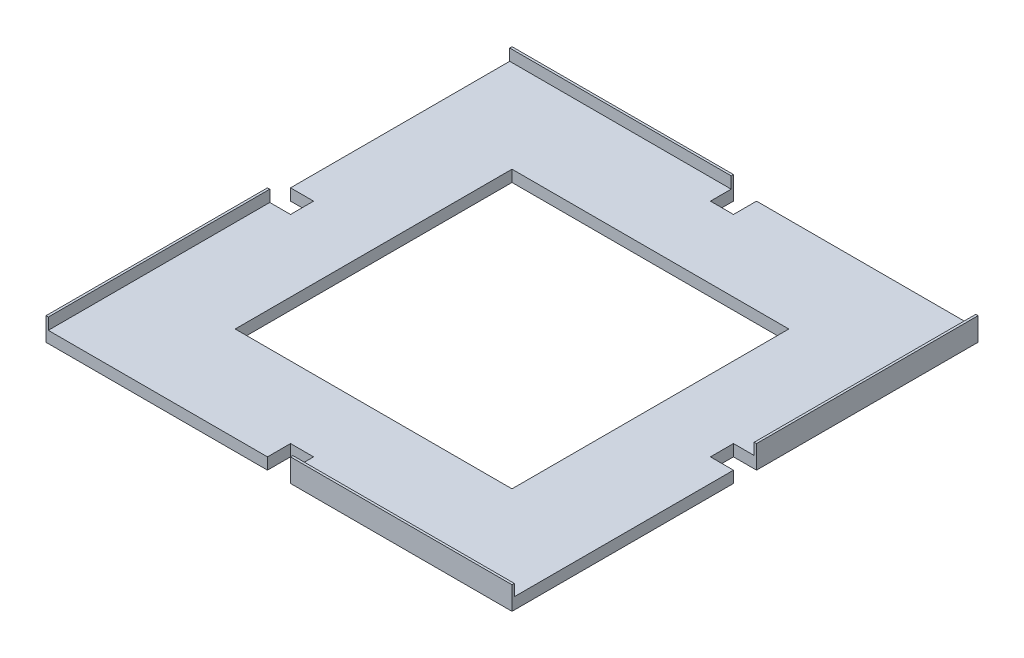
ISO-10303-21;
HEADER;
FILE_DESCRIPTION(('STEP AP214'),'2;1');
FILE_NAME('part.step','',(''),(''),'','','');
FILE_SCHEMA(('AUTOMOTIVE_DESIGN { 1 0 10303 214 1 1 1 1 }'));
ENDSEC;
DATA;
#1=APPLICATION_CONTEXT('core data for automotive mechanical design processes');
#2=APPLICATION_PROTOCOL_DEFINITION('international standard','automotive_design',2000,#1);
#3=PRODUCT_CONTEXT('',#1,'mechanical');
#4=PRODUCT('Part','Part','',(#3));
#5=PRODUCT_RELATED_PRODUCT_CATEGORY('part','',(#4));
#6=PRODUCT_DEFINITION_FORMATION('','',#4);
#7=PRODUCT_DEFINITION_CONTEXT('part definition',#1,'design');
#8=PRODUCT_DEFINITION('design','',#6,#7);
#9=PRODUCT_DEFINITION_SHAPE('','',#8);
#10=(LENGTH_UNIT() NAMED_UNIT(*) SI_UNIT(.MILLI.,.METRE.));
#11=(NAMED_UNIT(*) PLANE_ANGLE_UNIT() SI_UNIT($,.RADIAN.));
#12=(NAMED_UNIT(*) SI_UNIT($,.STERADIAN.) SOLID_ANGLE_UNIT());
#13=UNCERTAINTY_MEASURE_WITH_UNIT(LENGTH_MEASURE(1.E-05),#10,'distance_accuracy_value','');
#14=(GEOMETRIC_REPRESENTATION_CONTEXT(3) GLOBAL_UNCERTAINTY_ASSIGNED_CONTEXT((#13)) GLOBAL_UNIT_ASSIGNED_CONTEXT((#10,
#11,#12)) REPRESENTATION_CONTEXT('',''));
#15=CARTESIAN_POINT('',(0.,0.,0.));
#16=DIRECTION('',(0.,0.,1.));
#17=DIRECTION('',(1.,0.,0.));
#18=AXIS2_PLACEMENT_3D('',#15,#16,#17);
#19=CARTESIAN_POINT('',(0.,5.,0.));
#20=DIRECTION('',(0.,-1.,0.));
#21=DIRECTION('',(0.,0.,-1.));
#22=AXIS2_PLACEMENT_3D('',#19,#20,#21);
#23=PLANE('',#22);
#24=DIRECTION('',(0.,0.,-1.));
#25=VECTOR('',#24,1.);
#26=CARTESIAN_POINT('',(60.,5.,60.));
#27=LINE('',#26,#25);
#28=CARTESIAN_POINT('',(60.,5.,60.));
#29=VERTEX_POINT('',#28);
#30=CARTESIAN_POINT('',(60.,5.,-60.));
#31=VERTEX_POINT('',#30);
#32=EDGE_CURVE('E333',#29,#31,#27,.T.);
#33=ORIENTED_EDGE('',*,*,#32,.F.);
#34=DIRECTION('',(1.,0.,0.));
#35=VECTOR('',#34,1.);
#36=CARTESIAN_POINT('',(-60.,5.,60.));
#37=LINE('',#36,#35);
#38=CARTESIAN_POINT('',(-60.,5.,60.));
#39=VERTEX_POINT('',#38);
#40=EDGE_CURVE('E341',#39,#29,#37,.T.);
#41=ORIENTED_EDGE('',*,*,#40,.F.);
#42=DIRECTION('',(0.,0.,1.));
#43=VECTOR('',#42,1.);
#44=CARTESIAN_POINT('',(-60.,5.,60.));
#45=LINE('',#44,#43);
#46=CARTESIAN_POINT('',(-60.,5.,-60.));
#47=VERTEX_POINT('',#46);
#48=EDGE_CURVE('E338',#47,#39,#45,.T.);
#49=ORIENTED_EDGE('',*,*,#48,.F.);
#50=DIRECTION('',(-1.,0.,0.));
#51=VECTOR('',#50,1.);
#52=CARTESIAN_POINT('',(-60.,5.,-60.));
#53=LINE('',#52,#51);
#54=EDGE_CURVE('E335',#31,#47,#53,.T.);
#55=ORIENTED_EDGE('',*,*,#54,.F.);
#56=EDGE_LOOP('',(#33,#41,#49,#55));
#57=FACE_BOUND('',#56,.T.);
#58=DIRECTION('',(0.,0.,1.));
#59=VECTOR('',#58,1.);
#60=CARTESIAN_POINT('',(100.,5.,-4.99999999999894));
#61=LINE('',#60,#59);
#62=CARTESIAN_POINT('',(100.000000000001,5.,-100.999999999999));
#63=VERTEX_POINT('',#62);
#64=CARTESIAN_POINT('',(100.,5.,-5.));
#65=VERTEX_POINT('',#64);
#66=EDGE_CURVE('E257',#63,#65,#61,.T.);
#67=ORIENTED_EDGE('',*,*,#66,.F.);
#68=DIRECTION('',(-1.,0.,0.));
#69=VECTOR('',#68,1.);
#70=CARTESIAN_POINT('',(101.,5.,-101.));
#71=LINE('',#70,#69);
#72=CARTESIAN_POINT('',(5.00000000000002,5.,-101.));
#73=VERTEX_POINT('',#72);
#74=EDGE_CURVE('E246',#63,#73,#71,.T.);
#75=ORIENTED_EDGE('',*,*,#74,.T.);
#76=DIRECTION('',(0.,0.,1.));
#77=VECTOR('',#76,1.);
#78=CARTESIAN_POINT('',(5.00000000000002,5.,-101.));
#79=LINE('',#78,#77);
#80=CARTESIAN_POINT('',(5.00000000000001,5.,-91.));
#81=VERTEX_POINT('',#80);
#82=EDGE_CURVE('E255',#73,#81,#79,.T.);
#83=ORIENTED_EDGE('',*,*,#82,.T.);
#84=DIRECTION('',(-1.,0.,0.));
#85=VECTOR('',#84,1.);
#86=CARTESIAN_POINT('',(-5.,5.,-91.));
#87=LINE('',#86,#85);
#88=CARTESIAN_POINT('',(-5.,5.,-91.));
#89=VERTEX_POINT('',#88);
#90=EDGE_CURVE('E389',#81,#89,#87,.T.);
#91=ORIENTED_EDGE('',*,*,#90,.T.);
#92=DIRECTION('',(0.,0.,-1.));
#93=VECTOR('',#92,1.);
#94=CARTESIAN_POINT('',(-4.99999999999999,5.,-101.));
#95=LINE('',#94,#93);
#96=CARTESIAN_POINT('',(-4.99999999999999,5.,-100.));
#97=VERTEX_POINT('',#96);
#98=EDGE_CURVE('E391',#89,#97,#95,.T.);
#99=ORIENTED_EDGE('',*,*,#98,.T.);
#100=DIRECTION('',(1.,0.,0.));
#101=VECTOR('',#100,1.);
#102=CARTESIAN_POINT('',(-4.99999999999929,5.,-100.));
#103=LINE('',#102,#101);
#104=CARTESIAN_POINT('',(-101.,5.,-100.));
#105=VERTEX_POINT('',#104);
#106=EDGE_CURVE('E59',#105,#97,#103,.T.);
#107=ORIENTED_EDGE('',*,*,#106,.F.);
#108=DIRECTION('',(0.,0.,1.));
#109=VECTOR('',#108,1.);
#110=CARTESIAN_POINT('',(-101.,5.,-5.));
#111=LINE('',#110,#109);
#112=CARTESIAN_POINT('',(-101.,5.,-5.));
#113=VERTEX_POINT('',#112);
#114=EDGE_CURVE('E364',#105,#113,#111,.T.);
#115=ORIENTED_EDGE('',*,*,#114,.T.);
#116=DIRECTION('',(1.,0.,0.));
#117=VECTOR('',#116,1.);
#118=CARTESIAN_POINT('',(-101.,5.,-5.));
#119=LINE('',#118,#117);
#120=CARTESIAN_POINT('',(-90.9999999999999,5.,-5.00000000000001));
#121=VERTEX_POINT('',#120);
#122=EDGE_CURVE('E366',#113,#121,#119,.T.);
#123=ORIENTED_EDGE('',*,*,#122,.T.);
#124=DIRECTION('',(0.,0.,1.));
#125=VECTOR('',#124,1.);
#126=CARTESIAN_POINT('',(-91.,5.,5.00000000000001));
#127=LINE('',#126,#125);
#128=CARTESIAN_POINT('',(-91.,5.,5.00000000000001));
#129=VERTEX_POINT('',#128);
#130=EDGE_CURVE('E369',#121,#129,#127,.T.);
#131=ORIENTED_EDGE('',*,*,#130,.T.);
#132=DIRECTION('',(-1.,0.,0.));
#133=VECTOR('',#132,1.);
#134=CARTESIAN_POINT('',(-101.,5.,5.));
#135=LINE('',#134,#133);
#136=CARTESIAN_POINT('',(-100.,5.,5.));
#137=VERTEX_POINT('',#136);
#138=EDGE_CURVE('E371',#129,#137,#135,.T.);
#139=ORIENTED_EDGE('',*,*,#138,.T.);
#140=DIRECTION('',(0.,0.,-1.));
#141=VECTOR('',#140,1.);
#142=CARTESIAN_POINT('',(-100.,5.,4.99999999999964));
#143=LINE('',#142,#141);
#144=CARTESIAN_POINT('',(-100.,5.,101.));
#145=VERTEX_POINT('',#144);
#146=EDGE_CURVE('E301',#145,#137,#143,.T.);
#147=ORIENTED_EDGE('',*,*,#146,.F.);
#148=DIRECTION('',(1.,0.,0.));
#149=VECTOR('',#148,1.);
#150=CARTESIAN_POINT('',(-5.00000000000001,5.,101.));
#151=LINE('',#150,#149);
#152=CARTESIAN_POINT('',(-5.00000000000001,5.,101.));
#153=VERTEX_POINT('',#152);
#154=EDGE_CURVE('E373',#145,#153,#151,.T.);
#155=ORIENTED_EDGE('',*,*,#154,.T.);
#156=DIRECTION('',(0.,0.,-1.));
#157=VECTOR('',#156,1.);
#158=CARTESIAN_POINT('',(-5.00000000000001,5.,101.));
#159=LINE('',#158,#157);
#160=CARTESIAN_POINT('',(-4.99999999999998,5.,91.));
#161=VERTEX_POINT('',#160);
#162=EDGE_CURVE('E375',#153,#161,#159,.T.);
#163=ORIENTED_EDGE('',*,*,#162,.T.);
#164=DIRECTION('',(1.,0.,0.));
#165=VECTOR('',#164,1.);
#166=CARTESIAN_POINT('',(5.00000000000003,5.,91.));
#167=LINE('',#166,#165);
#168=CARTESIAN_POINT('',(5.00000000000003,5.,91.));
#169=VERTEX_POINT('',#168);
#170=EDGE_CURVE('E377',#161,#169,#167,.T.);
#171=ORIENTED_EDGE('',*,*,#170,.T.);
#172=DIRECTION('',(0.,0.,1.));
#173=VECTOR('',#172,1.);
#174=CARTESIAN_POINT('',(4.99999999999999,5.,101.));
#175=LINE('',#174,#173);
#176=CARTESIAN_POINT('',(4.99999999999999,5.,100.));
#177=VERTEX_POINT('',#176);
#178=EDGE_CURVE('E379',#169,#177,#175,.T.);
#179=ORIENTED_EDGE('',*,*,#178,.T.);
#180=DIRECTION('',(-1.,0.,0.));
#181=VECTOR('',#180,1.);
#182=CARTESIAN_POINT('',(4.99999999999999,5.,100.));
#183=LINE('',#182,#181);
#184=CARTESIAN_POINT('',(101.,5.,100.));
#185=VERTEX_POINT('',#184);
#186=EDGE_CURVE('E304',#185,#177,#183,.T.);
#187=ORIENTED_EDGE('',*,*,#186,.F.);
#188=DIRECTION('',(0.,0.,-1.));
#189=VECTOR('',#188,1.);
#190=CARTESIAN_POINT('',(101.,5.,101.));
#191=LINE('',#190,#189);
#192=CARTESIAN_POINT('',(101.,5.,5.));
#193=VERTEX_POINT('',#192);
#194=EDGE_CURVE('E381',#185,#193,#191,.T.);
#195=ORIENTED_EDGE('',*,*,#194,.T.);
#196=DIRECTION('',(-1.,0.,0.));
#197=VECTOR('',#196,1.);
#198=CARTESIAN_POINT('',(101.,5.,5.));
#199=LINE('',#198,#197);
#200=CARTESIAN_POINT('',(91.,5.,5.00000000000001));
#201=VERTEX_POINT('',#200);
#202=EDGE_CURVE('E383',#193,#201,#199,.T.);
#203=ORIENTED_EDGE('',*,*,#202,.T.);
#204=DIRECTION('',(0.,0.,-1.));
#205=VECTOR('',#204,1.);
#206=CARTESIAN_POINT('',(91.,5.,-4.99999999999999));
#207=LINE('',#206,#205);
#208=CARTESIAN_POINT('',(91.,5.,-4.99999999999999));
#209=VERTEX_POINT('',#208);
#210=EDGE_CURVE('E385',#201,#209,#207,.T.);
#211=ORIENTED_EDGE('',*,*,#210,.T.);
#212=DIRECTION('',(1.,0.,0.));
#213=VECTOR('',#212,1.);
#214=CARTESIAN_POINT('',(101.,5.,-5.));
#215=LINE('',#214,#213);
#216=EDGE_CURVE('E52',#209,#65,#215,.T.);
#217=ORIENTED_EDGE('',*,*,#216,.T.);
#218=EDGE_LOOP('',(#67,#75,#83,#91,#99,#107,#115,#123,#131,#139,#147,#155,#163,#171,#179,#187,
#195,#203,#211,#217));
#219=FACE_BOUND('',#218,.T.);
#220=ADVANCED_FACE('F37',(#57,#219),#23,.F.);
#221=CARTESIAN_POINT('',(0.,0.,0.));
#222=DIRECTION('',(0.,-1.,0.));
#223=DIRECTION('',(0.,0.,-1.));
#224=AXIS2_PLACEMENT_3D('',#221,#222,#223);
#225=PLANE('',#224);
#226=DIRECTION('',(-1.,0.,0.));
#227=VECTOR('',#226,1.);
#228=CARTESIAN_POINT('',(-4.99999999999999,0.,-101.));
#229=LINE('',#228,#227);
#230=CARTESIAN_POINT('',(-4.99999999999999,0.,-101.));
#231=VERTEX_POINT('',#230);
#232=CARTESIAN_POINT('',(-101.,0.,-101.));
#233=VERTEX_POINT('',#232);
#234=EDGE_CURVE('E363',#231,#233,#229,.T.);
#235=ORIENTED_EDGE('',*,*,#234,.F.);
#236=DIRECTION('',(0.,0.,-1.));
#237=VECTOR('',#236,1.);
#238=CARTESIAN_POINT('',(-4.99999999999999,0.,-101.));
#239=LINE('',#238,#237);
#240=CARTESIAN_POINT('',(-5.,0.,-91.));
#241=VERTEX_POINT('',#240);
#242=EDGE_CURVE('E367',#241,#231,#239,.T.);
#243=ORIENTED_EDGE('',*,*,#242,.F.);
#244=DIRECTION('',(-1.,0.,0.));
#245=VECTOR('',#244,1.);
#246=CARTESIAN_POINT('',(-5.,0.,-91.));
#247=LINE('',#246,#245);
#248=CARTESIAN_POINT('',(5.00000000000001,0.,-91.));
#249=VERTEX_POINT('',#248);
#250=EDGE_CURVE('E430',#249,#241,#247,.T.);
#251=ORIENTED_EDGE('',*,*,#250,.F.);
#252=DIRECTION('',(0.,0.,1.));
#253=VECTOR('',#252,1.);
#254=CARTESIAN_POINT('',(5.00000000000002,0.,-101.));
#255=LINE('',#254,#253);
#256=CARTESIAN_POINT('',(5.00000000000002,0.,-101.));
#257=VERTEX_POINT('',#256);
#258=EDGE_CURVE('E428',#257,#249,#255,.T.);
#259=ORIENTED_EDGE('',*,*,#258,.F.);
#260=DIRECTION('',(-1.,0.,0.));
#261=VECTOR('',#260,1.);
#262=CARTESIAN_POINT('',(101.,0.,-101.));
#263=LINE('',#262,#261);
#264=CARTESIAN_POINT('',(101.,0.,-101.));
#265=VERTEX_POINT('',#264);
#266=EDGE_CURVE('E426',#265,#257,#263,.T.);
#267=ORIENTED_EDGE('',*,*,#266,.F.);
#268=DIRECTION('',(0.,0.,-1.));
#269=VECTOR('',#268,1.);
#270=CARTESIAN_POINT('',(101.,0.,-5.));
#271=LINE('',#270,#269);
#272=CARTESIAN_POINT('',(101.,0.,-5.));
#273=VERTEX_POINT('',#272);
#274=EDGE_CURVE('E424',#273,#265,#271,.T.);
#275=ORIENTED_EDGE('',*,*,#274,.F.);
#276=DIRECTION('',(1.,0.,0.));
#277=VECTOR('',#276,1.);
#278=CARTESIAN_POINT('',(101.,0.,-5.));
#279=LINE('',#278,#277);
#280=CARTESIAN_POINT('',(91.,0.,-4.99999999999999));
#281=VERTEX_POINT('',#280);
#282=EDGE_CURVE('E422',#281,#273,#279,.T.);
#283=ORIENTED_EDGE('',*,*,#282,.F.);
#284=DIRECTION('',(0.,0.,-1.));
#285=VECTOR('',#284,1.);
#286=CARTESIAN_POINT('',(91.,0.,-4.99999999999999));
#287=LINE('',#286,#285);
#288=CARTESIAN_POINT('',(91.,0.,5.00000000000001));
#289=VERTEX_POINT('',#288);
#290=EDGE_CURVE('E420',#289,#281,#287,.T.);
#291=ORIENTED_EDGE('',*,*,#290,.F.);
#292=DIRECTION('',(-1.,0.,0.));
#293=VECTOR('',#292,1.);
#294=CARTESIAN_POINT('',(101.,0.,5.));
#295=LINE('',#294,#293);
#296=CARTESIAN_POINT('',(101.,0.,5.));
#297=VERTEX_POINT('',#296);
#298=EDGE_CURVE('E418',#297,#289,#295,.T.);
#299=ORIENTED_EDGE('',*,*,#298,.F.);
#300=DIRECTION('',(0.,0.,-1.));
#301=VECTOR('',#300,1.);
#302=CARTESIAN_POINT('',(101.,0.,101.));
#303=LINE('',#302,#301);
#304=CARTESIAN_POINT('',(101.,0.,101.));
#305=VERTEX_POINT('',#304);
#306=EDGE_CURVE('E416',#305,#297,#303,.T.);
#307=ORIENTED_EDGE('',*,*,#306,.F.);
#308=DIRECTION('',(1.,0.,0.));
#309=VECTOR('',#308,1.);
#310=CARTESIAN_POINT('',(101.,0.,101.));
#311=LINE('',#310,#309);
#312=CARTESIAN_POINT('',(4.99999999999999,0.,101.));
#313=VERTEX_POINT('',#312);
#314=EDGE_CURVE('E414',#313,#305,#311,.T.);
#315=ORIENTED_EDGE('',*,*,#314,.F.);
#316=DIRECTION('',(0.,0.,1.));
#317=VECTOR('',#316,1.);
#318=CARTESIAN_POINT('',(4.99999999999999,0.,101.));
#319=LINE('',#318,#317);
#320=CARTESIAN_POINT('',(5.00000000000003,0.,91.));
#321=VERTEX_POINT('',#320);
#322=EDGE_CURVE('E412',#321,#313,#319,.T.);
#323=ORIENTED_EDGE('',*,*,#322,.F.);
#324=DIRECTION('',(1.,0.,0.));
#325=VECTOR('',#324,1.);
#326=CARTESIAN_POINT('',(5.00000000000003,0.,91.));
#327=LINE('',#326,#325);
#328=CARTESIAN_POINT('',(-4.99999999999998,0.,91.));
#329=VERTEX_POINT('',#328);
#330=EDGE_CURVE('E410',#329,#321,#327,.T.);
#331=ORIENTED_EDGE('',*,*,#330,.F.);
#332=DIRECTION('',(0.,0.,-1.));
#333=VECTOR('',#332,1.);
#334=CARTESIAN_POINT('',(-5.00000000000001,0.,101.));
#335=LINE('',#334,#333);
#336=CARTESIAN_POINT('',(-5.00000000000001,0.,101.));
#337=VERTEX_POINT('',#336);
#338=EDGE_CURVE('E408',#337,#329,#335,.T.);
#339=ORIENTED_EDGE('',*,*,#338,.F.);
#340=DIRECTION('',(1.,0.,0.));
#341=VECTOR('',#340,1.);
#342=CARTESIAN_POINT('',(-5.00000000000001,0.,101.));
#343=LINE('',#342,#341);
#344=CARTESIAN_POINT('',(-101.,0.,101.));
#345=VERTEX_POINT('',#344);
#346=EDGE_CURVE('E406',#345,#337,#343,.T.);
#347=ORIENTED_EDGE('',*,*,#346,.F.);
#348=DIRECTION('',(0.,0.,1.));
#349=VECTOR('',#348,1.);
#350=CARTESIAN_POINT('',(-101.,0.,101.));
#351=LINE('',#350,#349);
#352=CARTESIAN_POINT('',(-101.,0.,5.));
#353=VERTEX_POINT('',#352);
#354=EDGE_CURVE('E404',#353,#345,#351,.T.);
#355=ORIENTED_EDGE('',*,*,#354,.F.);
#356=DIRECTION('',(-1.,0.,0.));
#357=VECTOR('',#356,1.);
#358=CARTESIAN_POINT('',(-101.,0.,5.));
#359=LINE('',#358,#357);
#360=CARTESIAN_POINT('',(-91.,0.,5.00000000000001));
#361=VERTEX_POINT('',#360);
#362=EDGE_CURVE('E402',#361,#353,#359,.T.);
#363=ORIENTED_EDGE('',*,*,#362,.F.);
#364=DIRECTION('',(0.,0.,1.));
#365=VECTOR('',#364,1.);
#366=CARTESIAN_POINT('',(-91.,0.,5.00000000000001));
#367=LINE('',#366,#365);
#368=CARTESIAN_POINT('',(-90.9999999999999,0.,-5.00000000000001));
#369=VERTEX_POINT('',#368);
#370=EDGE_CURVE('E400',#369,#361,#367,.T.);
#371=ORIENTED_EDGE('',*,*,#370,.F.);
#372=DIRECTION('',(1.,0.,0.));
#373=VECTOR('',#372,1.);
#374=CARTESIAN_POINT('',(-101.,0.,-5.));
#375=LINE('',#374,#373);
#376=CARTESIAN_POINT('',(-101.,0.,-5.));
#377=VERTEX_POINT('',#376);
#378=EDGE_CURVE('E398',#377,#369,#375,.T.);
#379=ORIENTED_EDGE('',*,*,#378,.F.);
#380=DIRECTION('',(0.,0.,1.));
#381=VECTOR('',#380,1.);
#382=CARTESIAN_POINT('',(-101.,0.,-5.));
#383=LINE('',#382,#381);
#384=EDGE_CURVE('E396',#233,#377,#383,.T.);
#385=ORIENTED_EDGE('',*,*,#384,.F.);
#386=EDGE_LOOP('',(#235,#243,#251,#259,#267,#275,#283,#291,#299,#307,#315,#323,#331,#339,#347,
#355,#363,#371,#379,#385));
#387=FACE_BOUND('',#386,.T.);
#388=DIRECTION('',(1.,0.,0.));
#389=VECTOR('',#388,1.);
#390=CARTESIAN_POINT('',(-60.,0.,60.));
#391=LINE('',#390,#389);
#392=CARTESIAN_POINT('',(-60.,0.,60.));
#393=VERTEX_POINT('',#392);
#394=CARTESIAN_POINT('',(60.,0.,60.));
#395=VERTEX_POINT('',#394);
#396=EDGE_CURVE('E336',#393,#395,#391,.T.);
#397=ORIENTED_EDGE('',*,*,#396,.T.);
#398=DIRECTION('',(0.,0.,-1.));
#399=VECTOR('',#398,1.);
#400=CARTESIAN_POINT('',(60.,0.,60.));
#401=LINE('',#400,#399);
#402=CARTESIAN_POINT('',(60.,0.,-60.));
#403=VERTEX_POINT('',#402);
#404=EDGE_CURVE('E332',#395,#403,#401,.T.);
#405=ORIENTED_EDGE('',*,*,#404,.T.);
#406=DIRECTION('',(-1.,0.,0.));
#407=VECTOR('',#406,1.);
#408=CARTESIAN_POINT('',(-60.,0.,-60.));
#409=LINE('',#408,#407);
#410=CARTESIAN_POINT('',(-60.,0.,-60.));
#411=VERTEX_POINT('',#410);
#412=EDGE_CURVE('E346',#403,#411,#409,.T.);
#413=ORIENTED_EDGE('',*,*,#412,.T.);
#414=DIRECTION('',(0.,0.,1.));
#415=VECTOR('',#414,1.);
#416=CARTESIAN_POINT('',(-60.,0.,60.));
#417=LINE('',#416,#415);
#418=EDGE_CURVE('E349',#411,#393,#417,.T.);
#419=ORIENTED_EDGE('',*,*,#418,.T.);
#420=EDGE_LOOP('',(#397,#405,#413,#419));
#421=FACE_BOUND('',#420,.T.);
#422=ADVANCED_FACE('F494',(#387,#421),#225,.T.);
#423=CARTESIAN_POINT('',(-4.99999999999999,5.,-101.));
#424=DIRECTION('',(0.,0.,1.));
#425=DIRECTION('',(1.,0.,0.));
#426=AXIS2_PLACEMENT_3D('',#423,#424,#425);
#427=PLANE('',#426);
#428=ORIENTED_EDGE('',*,*,#234,.T.);
#429=DIRECTION('',(0.,-1.,0.));
#430=VECTOR('',#429,1.);
#431=CARTESIAN_POINT('',(-101.,5.,-101.));
#432=LINE('',#431,#430);
#433=CARTESIAN_POINT('',(-100.999999999999,10.,-101.000000000001));
#434=VERTEX_POINT('',#433);
#435=EDGE_CURVE('E11',#434,#233,#432,.T.);
#436=ORIENTED_EDGE('',*,*,#435,.F.);
#437=DIRECTION('',(-1.,0.,0.));
#438=VECTOR('',#437,1.);
#439=CARTESIAN_POINT('',(-4.99999999999929,10.,-101.));
#440=LINE('',#439,#438);
#441=CARTESIAN_POINT('',(-4.99999999999929,10.,-101.));
#442=VERTEX_POINT('',#441);
#443=EDGE_CURVE('E286',#442,#434,#440,.T.);
#444=ORIENTED_EDGE('',*,*,#443,.F.);
#445=DIRECTION('',(0.,-1.,0.));
#446=VECTOR('',#445,1.);
#447=CARTESIAN_POINT('',(-4.99999999999999,5.,-101.));
#448=LINE('',#447,#446);
#449=EDGE_CURVE('E393',#442,#231,#448,.T.);
#450=ORIENTED_EDGE('',*,*,#449,.T.);
#451=EDGE_LOOP('',(#428,#436,#444,#450));
#452=FACE_BOUND('',#451,.T.);
#453=ADVANCED_FACE('F39',(#452),#427,.F.);
#454=CARTESIAN_POINT('',(-101.,5.,-5.));
#455=DIRECTION('',(1.,0.,0.));
#456=DIRECTION('',(0.,0.,-1.));
#457=AXIS2_PLACEMENT_3D('',#454,#455,#456);
#458=PLANE('',#457);
#459=ORIENTED_EDGE('',*,*,#384,.T.);
#460=DIRECTION('',(0.,-1.,0.));
#461=VECTOR('',#460,1.);
#462=CARTESIAN_POINT('',(-101.,5.,-5.));
#463=LINE('',#462,#461);
#464=EDGE_CURVE('E45',#113,#377,#463,.T.);
#465=ORIENTED_EDGE('',*,*,#464,.F.);
#466=ORIENTED_EDGE('',*,*,#114,.F.);
#467=DIRECTION('',(0.,-1.,0.));
#468=VECTOR('',#467,1.);
#469=CARTESIAN_POINT('',(-100.999999999999,10.,-100.000000000001));
#470=LINE('',#469,#468);
#471=CARTESIAN_POINT('',(-100.999999999999,10.,-100.000000000001));
#472=VERTEX_POINT('',#471);
#473=EDGE_CURVE('E261',#472,#105,#470,.T.);
#474=ORIENTED_EDGE('',*,*,#473,.F.);
#475=DIRECTION('',(0.,0.,1.));
#476=VECTOR('',#475,1.);
#477=CARTESIAN_POINT('',(-100.999999999999,10.,-101.000000000001));
#478=LINE('',#477,#476);
#479=EDGE_CURVE('E291',#434,#472,#478,.T.);
#480=ORIENTED_EDGE('',*,*,#479,.F.);
#481=ORIENTED_EDGE('',*,*,#435,.T.);
#482=EDGE_LOOP('',(#459,#465,#466,#474,#480,#481));
#483=FACE_BOUND('',#482,.T.);
#484=ADVANCED_FACE('F586',(#483),#458,.F.);
#485=CARTESIAN_POINT('',(-101.,5.,-5.));
#486=DIRECTION('',(0.,0.,-1.));
#487=DIRECTION('',(-1.,0.,0.));
#488=AXIS2_PLACEMENT_3D('',#485,#486,#487);
#489=PLANE('',#488);
#490=ORIENTED_EDGE('',*,*,#378,.T.);
#491=DIRECTION('',(0.,-1.,0.));
#492=VECTOR('',#491,1.);
#493=CARTESIAN_POINT('',(-90.9999999999999,5.,-5.00000000000001));
#494=LINE('',#493,#492);
#495=EDGE_CURVE('E481',#121,#369,#494,.T.);
#496=ORIENTED_EDGE('',*,*,#495,.F.);
#497=ORIENTED_EDGE('',*,*,#122,.F.);
#498=ORIENTED_EDGE('',*,*,#464,.T.);
#499=EDGE_LOOP('',(#490,#496,#497,#498));
#500=FACE_BOUND('',#499,.T.);
#501=ADVANCED_FACE('F488',(#500),#489,.F.);
#502=CARTESIAN_POINT('',(-91.,5.,5.00000000000001));
#503=DIRECTION('',(1.,0.,0.));
#504=DIRECTION('',(0.,0.,-1.));
#505=AXIS2_PLACEMENT_3D('',#502,#503,#504);
#506=PLANE('',#505);
#507=ORIENTED_EDGE('',*,*,#370,.T.);
#508=DIRECTION('',(0.,-1.,0.));
#509=VECTOR('',#508,1.);
#510=CARTESIAN_POINT('',(-91.,5.,5.00000000000001));
#511=LINE('',#510,#509);
#512=EDGE_CURVE('E478',#129,#361,#511,.T.);
#513=ORIENTED_EDGE('',*,*,#512,.F.);
#514=ORIENTED_EDGE('',*,*,#130,.F.);
#515=ORIENTED_EDGE('',*,*,#495,.T.);
#516=EDGE_LOOP('',(#507,#513,#514,#515));
#517=FACE_BOUND('',#516,.T.);
#518=ADVANCED_FACE('F500',(#517),#506,.F.);
#519=CARTESIAN_POINT('',(-101.,5.,5.));
#520=DIRECTION('',(0.,0.,1.));
#521=DIRECTION('',(1.,0.,0.));
#522=AXIS2_PLACEMENT_3D('',#519,#520,#521);
#523=PLANE('',#522);
#524=ORIENTED_EDGE('',*,*,#362,.T.);
#525=DIRECTION('',(0.,-1.,0.));
#526=VECTOR('',#525,1.);
#527=CARTESIAN_POINT('',(-101.,5.,5.));
#528=LINE('',#527,#526);
#529=CARTESIAN_POINT('',(-101.,10.,4.99999999999964));
#530=VERTEX_POINT('',#529);
#531=EDGE_CURVE('E475',#530,#353,#528,.T.);
#532=ORIENTED_EDGE('',*,*,#531,.F.);
#533=DIRECTION('',(-1.,0.,0.));
#534=VECTOR('',#533,1.);
#535=CARTESIAN_POINT('',(-101.,10.,4.99999999999964));
#536=LINE('',#535,#534);
#537=CARTESIAN_POINT('',(-100.,10.,4.99999999999964));
#538=VERTEX_POINT('',#537);
#539=EDGE_CURVE('E300',#538,#530,#536,.T.);
#540=ORIENTED_EDGE('',*,*,#539,.F.);
#541=DIRECTION('',(0.,-1.,0.));
#542=VECTOR('',#541,1.);
#543=CARTESIAN_POINT('',(-100.,10.,4.99999999999964));
#544=LINE('',#543,#542);
#545=EDGE_CURVE('E297',#538,#137,#544,.T.);
#546=ORIENTED_EDGE('',*,*,#545,.T.);
#547=ORIENTED_EDGE('',*,*,#138,.F.);
#548=ORIENTED_EDGE('',*,*,#512,.T.);
#549=EDGE_LOOP('',(#524,#532,#540,#546,#547,#548));
#550=FACE_BOUND('',#549,.T.);
#551=ADVANCED_FACE('F504',(#550),#523,.F.);
#552=CARTESIAN_POINT('',(-101.,5.,101.));
#553=DIRECTION('',(1.,0.,0.));
#554=DIRECTION('',(0.,0.,-1.));
#555=AXIS2_PLACEMENT_3D('',#552,#553,#554);
#556=PLANE('',#555);
#557=ORIENTED_EDGE('',*,*,#354,.T.);
#558=DIRECTION('',(0.,-1.,0.));
#559=VECTOR('',#558,1.);
#560=CARTESIAN_POINT('',(-101.,5.,101.));
#561=LINE('',#560,#559);
#562=CARTESIAN_POINT('',(-101.,10.,101.));
#563=VERTEX_POINT('',#562);
#564=EDGE_CURVE('E472',#563,#345,#561,.T.);
#565=ORIENTED_EDGE('',*,*,#564,.F.);
#566=DIRECTION('',(0.,0.,1.));
#567=VECTOR('',#566,1.);
#568=CARTESIAN_POINT('',(-101.,10.,4.99999999999964));
#569=LINE('',#568,#567);
#570=EDGE_CURVE('E305',#530,#563,#569,.T.);
#571=ORIENTED_EDGE('',*,*,#570,.F.);
#572=ORIENTED_EDGE('',*,*,#531,.T.);
#573=EDGE_LOOP('',(#557,#565,#571,#572));
#574=FACE_BOUND('',#573,.T.);
#575=ADVANCED_FACE('F635',(#574),#556,.F.);
#576=CARTESIAN_POINT('',(-5.00000000000001,5.,101.));
#577=DIRECTION('',(0.,0.,-1.));
#578=DIRECTION('',(-1.,0.,0.));
#579=AXIS2_PLACEMENT_3D('',#576,#577,#578);
#580=PLANE('',#579);
#581=ORIENTED_EDGE('',*,*,#346,.T.);
#582=DIRECTION('',(0.,-1.,0.));
#583=VECTOR('',#582,1.);
#584=CARTESIAN_POINT('',(-5.00000000000001,5.,101.));
#585=LINE('',#584,#583);
#586=EDGE_CURVE('E469',#153,#337,#585,.T.);
#587=ORIENTED_EDGE('',*,*,#586,.F.);
#588=ORIENTED_EDGE('',*,*,#154,.F.);
#589=DIRECTION('',(0.,-1.,0.));
#590=VECTOR('',#589,1.);
#591=CARTESIAN_POINT('',(-100.,10.,101.));
#592=LINE('',#591,#590);
#593=CARTESIAN_POINT('',(-100.,10.,101.));
#594=VERTEX_POINT('',#593);
#595=EDGE_CURVE('E285',#594,#145,#592,.T.);
#596=ORIENTED_EDGE('',*,*,#595,.F.);
#597=DIRECTION('',(1.,0.,0.));
#598=VECTOR('',#597,1.);
#599=CARTESIAN_POINT('',(-101.,10.,101.));
#600=LINE('',#599,#598);
#601=EDGE_CURVE('E310',#563,#594,#600,.T.);
#602=ORIENTED_EDGE('',*,*,#601,.F.);
#603=ORIENTED_EDGE('',*,*,#564,.T.);
#604=EDGE_LOOP('',(#581,#587,#588,#596,#602,#603));
#605=FACE_BOUND('',#604,.T.);
#606=ADVANCED_FACE('F514',(#605),#580,.F.);
#607=CARTESIAN_POINT('',(-5.00000000000001,5.,101.));
#608=DIRECTION('',(-1.,0.,0.));
#609=DIRECTION('',(0.,0.,1.));
#610=AXIS2_PLACEMENT_3D('',#607,#608,#609);
#611=PLANE('',#610);
#612=ORIENTED_EDGE('',*,*,#338,.T.);
#613=DIRECTION('',(0.,-1.,0.));
#614=VECTOR('',#613,1.);
#615=CARTESIAN_POINT('',(-4.99999999999998,5.,91.));
#616=LINE('',#615,#614);
#617=EDGE_CURVE('E466',#161,#329,#616,.T.);
#618=ORIENTED_EDGE('',*,*,#617,.F.);
#619=ORIENTED_EDGE('',*,*,#162,.F.);
#620=ORIENTED_EDGE('',*,*,#586,.T.);
#621=EDGE_LOOP('',(#612,#618,#619,#620));
#622=FACE_BOUND('',#621,.T.);
#623=ADVANCED_FACE('F521',(#622),#611,.F.);
#624=CARTESIAN_POINT('',(5.00000000000003,5.,91.));
#625=DIRECTION('',(0.,0.,-1.));
#626=DIRECTION('',(-1.,0.,0.));
#627=AXIS2_PLACEMENT_3D('',#624,#625,#626);
#628=PLANE('',#627);
#629=ORIENTED_EDGE('',*,*,#330,.T.);
#630=DIRECTION('',(0.,-1.,0.));
#631=VECTOR('',#630,1.);
#632=CARTESIAN_POINT('',(5.00000000000003,5.,91.));
#633=LINE('',#632,#631);
#634=EDGE_CURVE('E463',#169,#321,#633,.T.);
#635=ORIENTED_EDGE('',*,*,#634,.F.);
#636=ORIENTED_EDGE('',*,*,#170,.F.);
#637=ORIENTED_EDGE('',*,*,#617,.T.);
#638=EDGE_LOOP('',(#629,#635,#636,#637));
#639=FACE_BOUND('',#638,.T.);
#640=ADVANCED_FACE('F525',(#639),#628,.F.);
#641=CARTESIAN_POINT('',(4.99999999999999,5.,101.));
#642=DIRECTION('',(1.,0.,0.));
#643=DIRECTION('',(0.,0.,-1.));
#644=AXIS2_PLACEMENT_3D('',#641,#642,#643);
#645=PLANE('',#644);
#646=ORIENTED_EDGE('',*,*,#322,.T.);
#647=DIRECTION('',(0.,-1.,0.));
#648=VECTOR('',#647,1.);
#649=CARTESIAN_POINT('',(4.99999999999999,5.,101.));
#650=LINE('',#649,#648);
#651=CARTESIAN_POINT('',(4.99999999999999,10.,101.));
#652=VERTEX_POINT('',#651);
#653=EDGE_CURVE('E460',#652,#313,#650,.T.);
#654=ORIENTED_EDGE('',*,*,#653,.F.);
#655=DIRECTION('',(0.,0.,1.));
#656=VECTOR('',#655,1.);
#657=CARTESIAN_POINT('',(4.99999999999999,10.,101.));
#658=LINE('',#657,#656);
#659=CARTESIAN_POINT('',(4.99999999999999,10.,100.));
#660=VERTEX_POINT('',#659);
#661=EDGE_CURVE('E314',#660,#652,#658,.T.);
#662=ORIENTED_EDGE('',*,*,#661,.F.);
#663=DIRECTION('',(0.,-1.,0.));
#664=VECTOR('',#663,1.);
#665=CARTESIAN_POINT('',(4.99999999999999,10.,100.));
#666=LINE('',#665,#664);
#667=EDGE_CURVE('E324',#660,#177,#666,.T.);
#668=ORIENTED_EDGE('',*,*,#667,.T.);
#669=ORIENTED_EDGE('',*,*,#178,.F.);
#670=ORIENTED_EDGE('',*,*,#634,.T.);
#671=EDGE_LOOP('',(#646,#654,#662,#668,#669,#670));
#672=FACE_BOUND('',#671,.T.);
#673=ADVANCED_FACE('F529',(#672),#645,.F.);
#674=CARTESIAN_POINT('',(101.,5.,101.));
#675=DIRECTION('',(0.,0.,-1.));
#676=DIRECTION('',(-1.,0.,0.));
#677=AXIS2_PLACEMENT_3D('',#674,#675,#676);
#678=PLANE('',#677);
#679=ORIENTED_EDGE('',*,*,#314,.T.);
#680=DIRECTION('',(0.,-1.,0.));
#681=VECTOR('',#680,1.);
#682=CARTESIAN_POINT('',(101.,5.,101.));
#683=LINE('',#682,#681);
#684=CARTESIAN_POINT('',(101.,10.,101.));
#685=VERTEX_POINT('',#684);
#686=EDGE_CURVE('E457',#685,#305,#683,.T.);
#687=ORIENTED_EDGE('',*,*,#686,.F.);
#688=DIRECTION('',(1.,0.,0.));
#689=VECTOR('',#688,1.);
#690=CARTESIAN_POINT('',(4.99999999999999,10.,101.));
#691=LINE('',#690,#689);
#692=EDGE_CURVE('E317',#652,#685,#691,.T.);
#693=ORIENTED_EDGE('',*,*,#692,.F.);
#694=ORIENTED_EDGE('',*,*,#653,.T.);
#695=EDGE_LOOP('',(#679,#687,#693,#694));
#696=FACE_BOUND('',#695,.T.);
#697=ADVANCED_FACE('F623',(#696),#678,.F.);
#698=CARTESIAN_POINT('',(101.,5.,101.));
#699=DIRECTION('',(-1.,0.,0.));
#700=DIRECTION('',(0.,0.,1.));
#701=AXIS2_PLACEMENT_3D('',#698,#699,#700);
#702=PLANE('',#701);
#703=ORIENTED_EDGE('',*,*,#306,.T.);
#704=DIRECTION('',(0.,-1.,0.));
#705=VECTOR('',#704,1.);
#706=CARTESIAN_POINT('',(101.,5.,5.));
#707=LINE('',#706,#705);
#708=EDGE_CURVE('E454',#193,#297,#707,.T.);
#709=ORIENTED_EDGE('',*,*,#708,.F.);
#710=ORIENTED_EDGE('',*,*,#194,.F.);
#711=DIRECTION('',(0.,-1.,0.));
#712=VECTOR('',#711,1.);
#713=CARTESIAN_POINT('',(101.,10.,100.));
#714=LINE('',#713,#712);
#715=CARTESIAN_POINT('',(101.,10.,100.));
#716=VERTEX_POINT('',#715);
#717=EDGE_CURVE('E329',#716,#185,#714,.T.);
#718=ORIENTED_EDGE('',*,*,#717,.F.);
#719=DIRECTION('',(0.,0.,-1.));
#720=VECTOR('',#719,1.);
#721=CARTESIAN_POINT('',(101.,10.,101.));
#722=LINE('',#721,#720);
#723=EDGE_CURVE('E320',#685,#716,#722,.T.);
#724=ORIENTED_EDGE('',*,*,#723,.F.);
#725=ORIENTED_EDGE('',*,*,#686,.T.);
#726=EDGE_LOOP('',(#703,#709,#710,#718,#724,#725));
#727=FACE_BOUND('',#726,.T.);
#728=ADVANCED_FACE('F539',(#727),#702,.F.);
#729=CARTESIAN_POINT('',(101.,5.,5.));
#730=DIRECTION('',(0.,0.,1.));
#731=DIRECTION('',(1.,0.,0.));
#732=AXIS2_PLACEMENT_3D('',#729,#730,#731);
#733=PLANE('',#732);
#734=ORIENTED_EDGE('',*,*,#298,.T.);
#735=DIRECTION('',(0.,-1.,0.));
#736=VECTOR('',#735,1.);
#737=CARTESIAN_POINT('',(91.,5.,5.00000000000001));
#738=LINE('',#737,#736);
#739=EDGE_CURVE('E451',#201,#289,#738,.T.);
#740=ORIENTED_EDGE('',*,*,#739,.F.);
#741=ORIENTED_EDGE('',*,*,#202,.F.);
#742=ORIENTED_EDGE('',*,*,#708,.T.);
#743=EDGE_LOOP('',(#734,#740,#741,#742));
#744=FACE_BOUND('',#743,.T.);
#745=ADVANCED_FACE('F546',(#744),#733,.F.);
#746=CARTESIAN_POINT('',(91.,5.,-4.99999999999999));
#747=DIRECTION('',(-1.,0.,0.));
#748=DIRECTION('',(0.,0.,1.));
#749=AXIS2_PLACEMENT_3D('',#746,#747,#748);
#750=PLANE('',#749);
#751=ORIENTED_EDGE('',*,*,#290,.T.);
#752=DIRECTION('',(0.,-1.,0.));
#753=VECTOR('',#752,1.);
#754=CARTESIAN_POINT('',(91.,5.,-4.99999999999999));
#755=LINE('',#754,#753);
#756=EDGE_CURVE('E448',#209,#281,#755,.T.);
#757=ORIENTED_EDGE('',*,*,#756,.F.);
#758=ORIENTED_EDGE('',*,*,#210,.F.);
#759=ORIENTED_EDGE('',*,*,#739,.T.);
#760=EDGE_LOOP('',(#751,#757,#758,#759));
#761=FACE_BOUND('',#760,.T.);
#762=ADVANCED_FACE('F550',(#761),#750,.F.);
#763=CARTESIAN_POINT('',(101.,5.,-5.));
#764=DIRECTION('',(0.,0.,-1.));
#765=DIRECTION('',(-1.,0.,0.));
#766=AXIS2_PLACEMENT_3D('',#763,#764,#765);
#767=PLANE('',#766);
#768=ORIENTED_EDGE('',*,*,#282,.T.);
#769=DIRECTION('',(0.,-1.,0.));
#770=VECTOR('',#769,1.);
#771=CARTESIAN_POINT('',(101.,5.,-5.));
#772=LINE('',#771,#770);
#773=CARTESIAN_POINT('',(101.,10.,-4.99999999999893));
#774=VERTEX_POINT('',#773);
#775=EDGE_CURVE('E445',#774,#273,#772,.T.);
#776=ORIENTED_EDGE('',*,*,#775,.F.);
#777=DIRECTION('',(1.,0.,0.));
#778=VECTOR('',#777,1.);
#779=CARTESIAN_POINT('',(101.,10.,-4.99999999999893));
#780=LINE('',#779,#778);
#781=CARTESIAN_POINT('',(100.,10.,-4.99999999999894));
#782=VERTEX_POINT('',#781);
#783=EDGE_CURVE('E268',#782,#774,#780,.T.);
#784=ORIENTED_EDGE('',*,*,#783,.F.);
#785=DIRECTION('',(0.,-1.,0.));
#786=VECTOR('',#785,1.);
#787=CARTESIAN_POINT('',(100.,10.,-4.99999999999894));
#788=LINE('',#787,#786);
#789=EDGE_CURVE('E266',#782,#65,#788,.T.);
#790=ORIENTED_EDGE('',*,*,#789,.T.);
#791=ORIENTED_EDGE('',*,*,#216,.F.);
#792=ORIENTED_EDGE('',*,*,#756,.T.);
#793=EDGE_LOOP('',(#768,#776,#784,#790,#791,#792));
#794=FACE_BOUND('',#793,.T.);
#795=ADVANCED_FACE('F553',(#794),#767,.F.);
#796=CARTESIAN_POINT('',(101.,5.,-5.));
#797=DIRECTION('',(-1.,0.,0.));
#798=DIRECTION('',(0.,0.,1.));
#799=AXIS2_PLACEMENT_3D('',#796,#797,#798);
#800=PLANE('',#799);
#801=ORIENTED_EDGE('',*,*,#274,.T.);
#802=DIRECTION('',(0.,-1.,0.));
#803=VECTOR('',#802,1.);
#804=CARTESIAN_POINT('',(101.,5.,-101.));
#805=LINE('',#804,#803);
#806=CARTESIAN_POINT('',(101.000000000001,10.,-100.999999999999));
#807=VERTEX_POINT('',#806);
#808=EDGE_CURVE('E442',#807,#265,#805,.T.);
#809=ORIENTED_EDGE('',*,*,#808,.F.);
#810=DIRECTION('',(0.,0.,-1.));
#811=VECTOR('',#810,1.);
#812=CARTESIAN_POINT('',(101.,10.,-4.99999999999893));
#813=LINE('',#812,#811);
#814=EDGE_CURVE('E262',#774,#807,#813,.T.);
#815=ORIENTED_EDGE('',*,*,#814,.F.);
#816=ORIENTED_EDGE('',*,*,#775,.T.);
#817=EDGE_LOOP('',(#801,#809,#815,#816));
#818=FACE_BOUND('',#817,.T.);
#819=ADVANCED_FACE('F559',(#818),#800,.F.);
#820=CARTESIAN_POINT('',(101.,5.,-101.));
#821=DIRECTION('',(0.,0.,1.));
#822=DIRECTION('',(1.,0.,0.));
#823=AXIS2_PLACEMENT_3D('',#820,#821,#822);
#824=PLANE('',#823);
#825=ORIENTED_EDGE('',*,*,#266,.T.);
#826=DIRECTION('',(0.,-1.,0.));
#827=VECTOR('',#826,1.);
#828=CARTESIAN_POINT('',(5.00000000000002,5.,-101.));
#829=LINE('',#828,#827);
#830=EDGE_CURVE('E253',#73,#257,#829,.T.);
#831=ORIENTED_EDGE('',*,*,#830,.F.);
#832=ORIENTED_EDGE('',*,*,#74,.F.);
#833=DIRECTION('',(0.,-1.,0.));
#834=VECTOR('',#833,1.);
#835=CARTESIAN_POINT('',(100.000000000001,10.,-100.999999999999));
#836=LINE('',#835,#834);
#837=CARTESIAN_POINT('',(100.000000000001,10.,-100.999999999999));
#838=VERTEX_POINT('',#837);
#839=EDGE_CURVE('E250',#838,#63,#836,.T.);
#840=ORIENTED_EDGE('',*,*,#839,.F.);
#841=DIRECTION('',(-1.,0.,0.));
#842=VECTOR('',#841,1.);
#843=CARTESIAN_POINT('',(101.000000000001,10.,-100.999999999999));
#844=LINE('',#843,#842);
#845=EDGE_CURVE('E274',#807,#838,#844,.T.);
#846=ORIENTED_EDGE('',*,*,#845,.F.);
#847=ORIENTED_EDGE('',*,*,#808,.T.);
#848=EDGE_LOOP('',(#825,#831,#832,#840,#846,#847));
#849=FACE_BOUND('',#848,.T.);
#850=ADVANCED_FACE('F247',(#849),#824,.F.);
#851=CARTESIAN_POINT('',(5.00000000000002,5.,-101.));
#852=DIRECTION('',(1.,0.,0.));
#853=DIRECTION('',(0.,0.,-1.));
#854=AXIS2_PLACEMENT_3D('',#851,#852,#853);
#855=PLANE('',#854);
#856=ORIENTED_EDGE('',*,*,#258,.T.);
#857=DIRECTION('',(0.,-1.,0.));
#858=VECTOR('',#857,1.);
#859=CARTESIAN_POINT('',(5.00000000000001,5.,-91.));
#860=LINE('',#859,#858);
#861=EDGE_CURVE('E438',#81,#249,#860,.T.);
#862=ORIENTED_EDGE('',*,*,#861,.F.);
#863=ORIENTED_EDGE('',*,*,#82,.F.);
#864=ORIENTED_EDGE('',*,*,#830,.T.);
#865=EDGE_LOOP('',(#856,#862,#863,#864));
#866=FACE_BOUND('',#865,.T.);
#867=ADVANCED_FACE('F567',(#866),#855,.F.);
#868=CARTESIAN_POINT('',(-5.,5.,-91.));
#869=DIRECTION('',(0.,0.,1.));
#870=DIRECTION('',(1.,0.,0.));
#871=AXIS2_PLACEMENT_3D('',#868,#869,#870);
#872=PLANE('',#871);
#873=ORIENTED_EDGE('',*,*,#250,.T.);
#874=DIRECTION('',(0.,-1.,0.));
#875=VECTOR('',#874,1.);
#876=CARTESIAN_POINT('',(-5.,5.,-91.));
#877=LINE('',#876,#875);
#878=EDGE_CURVE('E435',#89,#241,#877,.T.);
#879=ORIENTED_EDGE('',*,*,#878,.F.);
#880=ORIENTED_EDGE('',*,*,#90,.F.);
#881=ORIENTED_EDGE('',*,*,#861,.T.);
#882=EDGE_LOOP('',(#873,#879,#880,#881));
#883=FACE_BOUND('',#882,.T.);
#884=ADVANCED_FACE('F570',(#883),#872,.F.);
#885=CARTESIAN_POINT('',(-4.99999999999999,5.,-101.));
#886=DIRECTION('',(-1.,0.,0.));
#887=DIRECTION('',(0.,0.,1.));
#888=AXIS2_PLACEMENT_3D('',#885,#886,#887);
#889=PLANE('',#888);
#890=ORIENTED_EDGE('',*,*,#242,.T.);
#891=ORIENTED_EDGE('',*,*,#449,.F.);
#892=DIRECTION('',(0.,0.,-1.));
#893=VECTOR('',#892,1.);
#894=CARTESIAN_POINT('',(-4.99999999999929,10.,-101.));
#895=LINE('',#894,#893);
#896=CARTESIAN_POINT('',(-4.99999999999929,10.,-100.));
#897=VERTEX_POINT('',#896);
#898=EDGE_CURVE('E283',#897,#442,#895,.T.);
#899=ORIENTED_EDGE('',*,*,#898,.F.);
#900=DIRECTION('',(0.,-1.,0.));
#901=VECTOR('',#900,1.);
#902=CARTESIAN_POINT('',(-4.99999999999929,10.,-100.));
#903=LINE('',#902,#901);
#904=EDGE_CURVE('E280',#897,#97,#903,.T.);
#905=ORIENTED_EDGE('',*,*,#904,.T.);
#906=ORIENTED_EDGE('',*,*,#98,.F.);
#907=ORIENTED_EDGE('',*,*,#878,.T.);
#908=EDGE_LOOP('',(#890,#891,#899,#905,#906,#907));
#909=FACE_BOUND('',#908,.T.);
#910=ADVANCED_FACE('F580',(#909),#889,.F.);
#911=CARTESIAN_POINT('',(60.,5.,60.));
#912=DIRECTION('',(-1.,0.,0.));
#913=DIRECTION('',(0.,0.,1.));
#914=AXIS2_PLACEMENT_3D('',#911,#912,#913);
#915=PLANE('',#914);
#916=ORIENTED_EDGE('',*,*,#404,.F.);
#917=DIRECTION('',(0.,-1.,0.));
#918=VECTOR('',#917,1.);
#919=CARTESIAN_POINT('',(60.,5.,60.));
#920=LINE('',#919,#918);
#921=EDGE_CURVE('E343',#29,#395,#920,.T.);
#922=ORIENTED_EDGE('',*,*,#921,.F.);
#923=ORIENTED_EDGE('',*,*,#32,.T.);
#924=DIRECTION('',(0.,-1.,0.));
#925=VECTOR('',#924,1.);
#926=CARTESIAN_POINT('',(60.,5.,-60.));
#927=LINE('',#926,#925);
#928=EDGE_CURVE('E360',#31,#403,#927,.T.);
#929=ORIENTED_EDGE('',*,*,#928,.T.);
#930=EDGE_LOOP('',(#916,#922,#923,#929));
#931=FACE_BOUND('',#930,.T.);
#932=ADVANCED_FACE('F602',(#931),#915,.T.);
#933=CARTESIAN_POINT('',(-60.,5.,-60.));
#934=DIRECTION('',(0.,0.,1.));
#935=DIRECTION('',(1.,0.,0.));
#936=AXIS2_PLACEMENT_3D('',#933,#934,#935);
#937=PLANE('',#936);
#938=ORIENTED_EDGE('',*,*,#412,.F.);
#939=ORIENTED_EDGE('',*,*,#928,.F.);
#940=ORIENTED_EDGE('',*,*,#54,.T.);
#941=DIRECTION('',(0.,-1.,0.));
#942=VECTOR('',#941,1.);
#943=CARTESIAN_POINT('',(-60.,5.,-60.));
#944=LINE('',#943,#942);
#945=EDGE_CURVE('E358',#47,#411,#944,.T.);
#946=ORIENTED_EDGE('',*,*,#945,.T.);
#947=EDGE_LOOP('',(#938,#939,#940,#946));
#948=FACE_BOUND('',#947,.T.);
#949=ADVANCED_FACE('F717',(#948),#937,.T.);
#950=CARTESIAN_POINT('',(-60.,5.,60.));
#951=DIRECTION('',(1.,0.,0.));
#952=DIRECTION('',(0.,0.,-1.));
#953=AXIS2_PLACEMENT_3D('',#950,#951,#952);
#954=PLANE('',#953);
#955=ORIENTED_EDGE('',*,*,#418,.F.);
#956=ORIENTED_EDGE('',*,*,#945,.F.);
#957=ORIENTED_EDGE('',*,*,#48,.T.);
#958=DIRECTION('',(0.,-1.,0.));
#959=VECTOR('',#958,1.);
#960=CARTESIAN_POINT('',(-60.,5.,60.));
#961=LINE('',#960,#959);
#962=EDGE_CURVE('E356',#39,#393,#961,.T.);
#963=ORIENTED_EDGE('',*,*,#962,.T.);
#964=EDGE_LOOP('',(#955,#956,#957,#963));
#965=FACE_BOUND('',#964,.T.);
#966=ADVANCED_FACE('F724',(#965),#954,.T.);
#967=CARTESIAN_POINT('',(-60.,5.,60.));
#968=DIRECTION('',(0.,0.,-1.));
#969=DIRECTION('',(-1.,0.,0.));
#970=AXIS2_PLACEMENT_3D('',#967,#968,#969);
#971=PLANE('',#970);
#972=ORIENTED_EDGE('',*,*,#396,.F.);
#973=ORIENTED_EDGE('',*,*,#962,.F.);
#974=ORIENTED_EDGE('',*,*,#40,.T.);
#975=ORIENTED_EDGE('',*,*,#921,.T.);
#976=EDGE_LOOP('',(#972,#973,#974,#975));
#977=FACE_BOUND('',#976,.T.);
#978=ADVANCED_FACE('F731',(#977),#971,.T.);
#979=CARTESIAN_POINT('',(4.99999999999999,10.,100.));
#980=DIRECTION('',(0.,0.,1.));
#981=DIRECTION('',(1.,0.,0.));
#982=AXIS2_PLACEMENT_3D('',#979,#980,#981);
#983=PLANE('',#982);
#984=ORIENTED_EDGE('',*,*,#186,.T.);
#985=ORIENTED_EDGE('',*,*,#667,.F.);
#986=DIRECTION('',(-1.,0.,0.));
#987=VECTOR('',#986,1.);
#988=CARTESIAN_POINT('',(4.99999999999999,10.,100.));
#989=LINE('',#988,#987);
#990=EDGE_CURVE('E322',#716,#660,#989,.T.);
#991=ORIENTED_EDGE('',*,*,#990,.F.);
#992=ORIENTED_EDGE('',*,*,#717,.T.);
#993=EDGE_LOOP('',(#984,#985,#991,#992));
#994=FACE_BOUND('',#993,.T.);
#995=ADVANCED_FACE('F534',(#994),#983,.F.);
#996=CARTESIAN_POINT('',(0.,10.,0.));
#997=DIRECTION('',(0.,-1.,0.));
#998=DIRECTION('',(0.,0.,-1.));
#999=AXIS2_PLACEMENT_3D('',#996,#997,#998);
#1000=PLANE('',#999);
#1001=ORIENTED_EDGE('',*,*,#661,.T.);
#1002=ORIENTED_EDGE('',*,*,#692,.T.);
#1003=ORIENTED_EDGE('',*,*,#723,.T.);
#1004=ORIENTED_EDGE('',*,*,#990,.T.);
#1005=EDGE_LOOP('',(#1001,#1002,#1003,#1004));
#1006=FACE_BOUND('',#1005,.T.);
#1007=ADVANCED_FACE('F745',(#1006),#1000,.F.);
#1008=CARTESIAN_POINT('',(-100.,10.,4.99999999999964));
#1009=DIRECTION('',(-1.,0.,0.));
#1010=DIRECTION('',(0.,0.,1.));
#1011=AXIS2_PLACEMENT_3D('',#1008,#1009,#1010);
#1012=PLANE('',#1011);
#1013=ORIENTED_EDGE('',*,*,#146,.T.);
#1014=ORIENTED_EDGE('',*,*,#545,.F.);
#1015=DIRECTION('',(0.,0.,-1.));
#1016=VECTOR('',#1015,1.);
#1017=CARTESIAN_POINT('',(-100.,10.,4.99999999999964));
#1018=LINE('',#1017,#1016);
#1019=EDGE_CURVE('E308',#594,#538,#1018,.T.);
#1020=ORIENTED_EDGE('',*,*,#1019,.F.);
#1021=ORIENTED_EDGE('',*,*,#595,.T.);
#1022=EDGE_LOOP('',(#1013,#1014,#1020,#1021));
#1023=FACE_BOUND('',#1022,.T.);
#1024=ADVANCED_FACE('F509',(#1023),#1012,.F.);
#1025=CARTESIAN_POINT('',(0.,10.,0.));
#1026=DIRECTION('',(0.,1.,0.));
#1027=DIRECTION('',(0.,0.,1.));
#1028=AXIS2_PLACEMENT_3D('',#1025,#1026,#1027);
#1029=PLANE('',#1028);
#1030=ORIENTED_EDGE('',*,*,#570,.T.);
#1031=ORIENTED_EDGE('',*,*,#601,.T.);
#1032=ORIENTED_EDGE('',*,*,#1019,.T.);
#1033=ORIENTED_EDGE('',*,*,#539,.T.);
#1034=EDGE_LOOP('',(#1030,#1031,#1032,#1033));
#1035=FACE_BOUND('',#1034,.T.);
#1036=ADVANCED_FACE('F759',(#1035),#1029,.T.);
#1037=CARTESIAN_POINT('',(-4.99999999999929,10.,-100.));
#1038=DIRECTION('',(0.,0.,-1.));
#1039=DIRECTION('',(-1.,0.,0.));
#1040=AXIS2_PLACEMENT_3D('',#1037,#1038,#1039);
#1041=PLANE('',#1040);
#1042=ORIENTED_EDGE('',*,*,#106,.T.);
#1043=ORIENTED_EDGE('',*,*,#904,.F.);
#1044=DIRECTION('',(1.,0.,0.));
#1045=VECTOR('',#1044,1.);
#1046=CARTESIAN_POINT('',(-4.99999999999929,10.,-100.));
#1047=LINE('',#1046,#1045);
#1048=EDGE_CURVE('E289',#472,#897,#1047,.T.);
#1049=ORIENTED_EDGE('',*,*,#1048,.F.);
#1050=ORIENTED_EDGE('',*,*,#473,.T.);
#1051=EDGE_LOOP('',(#1042,#1043,#1049,#1050));
#1052=FACE_BOUND('',#1051,.T.);
#1053=ADVANCED_FACE('F576',(#1052),#1041,.F.);
#1054=CARTESIAN_POINT('',(0.,10.,0.));
#1055=DIRECTION('',(0.,1.,0.));
#1056=DIRECTION('',(0.,0.,1.));
#1057=AXIS2_PLACEMENT_3D('',#1054,#1055,#1056);
#1058=PLANE('',#1057);
#1059=ORIENTED_EDGE('',*,*,#443,.T.);
#1060=ORIENTED_EDGE('',*,*,#479,.T.);
#1061=ORIENTED_EDGE('',*,*,#1048,.T.);
#1062=ORIENTED_EDGE('',*,*,#898,.T.);
#1063=EDGE_LOOP('',(#1059,#1060,#1061,#1062));
#1064=FACE_BOUND('',#1063,.T.);
#1065=ADVANCED_FACE('F583',(#1064),#1058,.T.);
#1066=CARTESIAN_POINT('',(100.,10.,-4.99999999999894));
#1067=DIRECTION('',(1.,0.,0.));
#1068=DIRECTION('',(0.,0.,-1.));
#1069=AXIS2_PLACEMENT_3D('',#1066,#1067,#1068);
#1070=PLANE('',#1069);
#1071=ORIENTED_EDGE('',*,*,#66,.T.);
#1072=ORIENTED_EDGE('',*,*,#789,.F.);
#1073=DIRECTION('',(0.,0.,1.));
#1074=VECTOR('',#1073,1.);
#1075=CARTESIAN_POINT('',(100.,10.,-4.99999999999894));
#1076=LINE('',#1075,#1074);
#1077=EDGE_CURVE('E265',#838,#782,#1076,.T.);
#1078=ORIENTED_EDGE('',*,*,#1077,.F.);
#1079=ORIENTED_EDGE('',*,*,#839,.T.);
#1080=EDGE_LOOP('',(#1071,#1072,#1078,#1079));
#1081=FACE_BOUND('',#1080,.T.);
#1082=ADVANCED_FACE('F264',(#1081),#1070,.F.);
#1083=CARTESIAN_POINT('',(0.,10.,0.));
#1084=DIRECTION('',(0.,1.,0.));
#1085=DIRECTION('',(0.,0.,1.));
#1086=AXIS2_PLACEMENT_3D('',#1083,#1084,#1085);
#1087=PLANE('',#1086);
#1088=ORIENTED_EDGE('',*,*,#814,.T.);
#1089=ORIENTED_EDGE('',*,*,#845,.T.);
#1090=ORIENTED_EDGE('',*,*,#1077,.T.);
#1091=ORIENTED_EDGE('',*,*,#783,.T.);
#1092=EDGE_LOOP('',(#1088,#1089,#1090,#1091));
#1093=FACE_BOUND('',#1092,.T.);
#1094=ADVANCED_FACE('F557',(#1093),#1087,.T.);
#1095=CLOSED_SHELL('',(#220,#422,#453,#484,#501,#518,#551,#575,#606,#623,#640,#673,#697,#728,
#745,#762,#795,#819,#850,#867,#884,#910,#932,#949,#966,#978,#995,#1007,#1024,#1036,#1053,#1065,
#1082,#1094));
#1096=MANIFOLD_SOLID_BREP('B2',#1095);
#1097=ADVANCED_BREP_SHAPE_REPRESENTATION('',(#18,#1096),#14);
#1098=SHAPE_DEFINITION_REPRESENTATION(#9,#1097);
ENDSEC;
END-ISO-10303-21;
